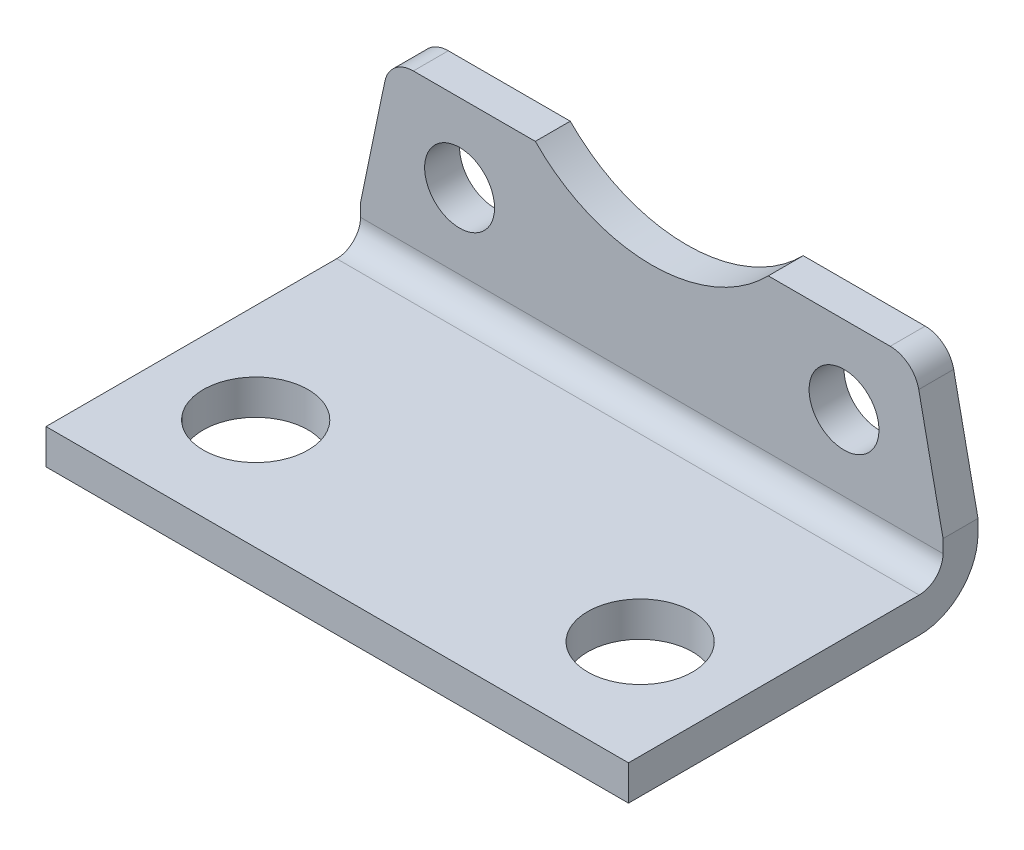
ISO-10303-21;
HEADER;
FILE_DESCRIPTION(('STEP AP214'),'2;1');
FILE_NAME('part.step','',(''),(''),'','','');
FILE_SCHEMA(('AUTOMOTIVE_DESIGN { 1 0 10303 214 1 1 1 1 }'));
ENDSEC;
DATA;
#1=APPLICATION_CONTEXT('core data for automotive mechanical design processes');
#2=APPLICATION_PROTOCOL_DEFINITION('international standard','automotive_design',2000,#1);
#3=PRODUCT_CONTEXT('',#1,'mechanical');
#4=PRODUCT('Part','Part','',(#3));
#5=PRODUCT_RELATED_PRODUCT_CATEGORY('part','',(#4));
#6=PRODUCT_DEFINITION_FORMATION('','',#4);
#7=PRODUCT_DEFINITION_CONTEXT('part definition',#1,'design');
#8=PRODUCT_DEFINITION('design','',#6,#7);
#9=PRODUCT_DEFINITION_SHAPE('','',#8);
#10=(LENGTH_UNIT() NAMED_UNIT(*) SI_UNIT(.MILLI.,.METRE.));
#11=(NAMED_UNIT(*) PLANE_ANGLE_UNIT() SI_UNIT($,.RADIAN.));
#12=(NAMED_UNIT(*) SI_UNIT($,.STERADIAN.) SOLID_ANGLE_UNIT());
#13=UNCERTAINTY_MEASURE_WITH_UNIT(LENGTH_MEASURE(1.E-05),#10,'distance_accuracy_value','');
#14=(GEOMETRIC_REPRESENTATION_CONTEXT(3) GLOBAL_UNCERTAINTY_ASSIGNED_CONTEXT((#13)) GLOBAL_UNIT_ASSIGNED_CONTEXT((#10,
#11,#12)) REPRESENTATION_CONTEXT('',''));
#15=CARTESIAN_POINT('',(0.,0.,0.));
#16=DIRECTION('',(0.,0.,1.));
#17=DIRECTION('',(1.,0.,0.));
#18=AXIS2_PLACEMENT_3D('',#15,#16,#17);
#19=CARTESIAN_POINT('',(-25.,5.05,49.5));
#20=DIRECTION('',(0.,0.,1.));
#21=DIRECTION('',(1.,0.,0.));
#22=AXIS2_PLACEMENT_3D('',#19,#20,#21);
#23=PLANE('',#22);
#24=DIRECTION('',(0.203466721205623,-0.979081862441458,0.));
#25=VECTOR('',#24,1.);
#26=CARTESIAN_POINT('',(22.5,18.2,49.5));
#27=LINE('',#26,#25);
#28=CARTESIAN_POINT('',(22.9138265164144,16.2086668030141,49.5));
#29=VERTEX_POINT('',#28);
#30=CARTESIAN_POINT('',(25.,6.17,49.5));
#31=VERTEX_POINT('',#30);
#32=EDGE_CURVE('E152',#29,#31,#27,.T.);
#33=ORIENTED_EDGE('',*,*,#32,.F.);
#34=CARTESIAN_POINT('',(20.4661218603107,15.7,49.5));
#35=DIRECTION('',(0.,0.,1.));
#36=DIRECTION('',(1.,0.,0.));
#37=AXIS2_PLACEMENT_3D('',#34,#35,#36);
#38=CIRCLE('',#37,2.5);
#39=CARTESIAN_POINT('',(20.4661218603107,18.2,49.5));
#40=VERTEX_POINT('',#39);
#41=EDGE_CURVE('E202',#29,#40,#38,.T.);
#42=ORIENTED_EDGE('',*,*,#41,.T.);
#43=DIRECTION('',(1.,0.,0.));
#44=VECTOR('',#43,1.);
#45=CARTESIAN_POINT('',(-25.,18.2,49.5));
#46=LINE('',#45,#44);
#47=CARTESIAN_POINT('',(9.99799979995999,18.2,49.5));
#48=VERTEX_POINT('',#47);
#49=EDGE_CURVE('E224',#48,#40,#46,.T.);
#50=ORIENTED_EDGE('',*,*,#49,.F.);
#51=CARTESIAN_POINT('',(0.,28.,49.5));
#52=DIRECTION('',(0.,0.,1.));
#53=DIRECTION('',(1.,0.,0.));
#54=AXIS2_PLACEMENT_3D('',#51,#52,#53);
#55=CIRCLE('',#54,14.);
#56=CARTESIAN_POINT('',(-9.99799979995999,18.2,49.5));
#57=VERTEX_POINT('',#56);
#58=EDGE_CURVE('E222',#57,#48,#55,.T.);
#59=ORIENTED_EDGE('',*,*,#58,.F.);
#60=CARTESIAN_POINT('',(-20.4661218603107,18.2,49.5));
#61=VERTEX_POINT('',#60);
#62=EDGE_CURVE('E213',#61,#57,#46,.T.);
#63=ORIENTED_EDGE('',*,*,#62,.F.);
#64=CARTESIAN_POINT('',(-20.4661218603107,15.7,49.5));
#65=DIRECTION('',(0.,0.,1.));
#66=DIRECTION('',(1.,0.,0.));
#67=AXIS2_PLACEMENT_3D('',#64,#65,#66);
#68=CIRCLE('',#67,2.5);
#69=CARTESIAN_POINT('',(-22.9138265164144,16.2086668030141,49.5));
#70=VERTEX_POINT('',#69);
#71=EDGE_CURVE('E200',#61,#70,#68,.T.);
#72=ORIENTED_EDGE('',*,*,#71,.T.);
#73=DIRECTION('',(0.203466721205623,0.979081862441458,0.));
#74=VECTOR('',#73,1.);
#75=CARTESIAN_POINT('',(-22.5,18.2,49.5));
#76=LINE('',#75,#74);
#77=CARTESIAN_POINT('',(-25.,6.17,49.5));
#78=VERTEX_POINT('',#77);
#79=EDGE_CURVE('E292',#78,#70,#76,.T.);
#80=ORIENTED_EDGE('',*,*,#79,.F.);
#81=DIRECTION('',(0.,-1.,0.));
#82=VECTOR('',#81,1.);
#83=CARTESIAN_POINT('',(-25.,5.05,49.5));
#84=LINE('',#83,#82);
#85=CARTESIAN_POINT('',(-25.,5.05,49.5));
#86=VERTEX_POINT('',#85);
#87=EDGE_CURVE('E265',#78,#86,#84,.T.);
#88=ORIENTED_EDGE('',*,*,#87,.T.);
#89=DIRECTION('',(1.,0.,0.));
#90=VECTOR('',#89,1.);
#91=CARTESIAN_POINT('',(-25.,5.05,49.5));
#92=LINE('',#91,#90);
#93=CARTESIAN_POINT('',(25.,5.05,49.5));
#94=VERTEX_POINT('',#93);
#95=EDGE_CURVE('E185',#86,#94,#92,.T.);
#96=ORIENTED_EDGE('',*,*,#95,.T.);
#97=DIRECTION('',(0.,-1.,0.));
#98=VECTOR('',#97,1.);
#99=CARTESIAN_POINT('',(25.,5.05,49.5));
#100=LINE('',#99,#98);
#101=EDGE_CURVE('E161',#31,#94,#100,.T.);
#102=ORIENTED_EDGE('',*,*,#101,.F.);
#103=EDGE_LOOP('',(#33,#42,#50,#59,#63,#72,#80,#88,#96,#102));
#104=FACE_BOUND('',#103,.T.);
#105=CARTESIAN_POINT('',(-16.5,11.5,49.5));
#106=DIRECTION('',(0.,0.,1.));
#107=DIRECTION('',(1.,0.,0.));
#108=AXIS2_PLACEMENT_3D('',#105,#106,#107);
#109=CIRCLE('',#108,3.);
#110=CARTESIAN_POINT('',(-13.5,11.5,49.5));
#111=VERTEX_POINT('',#110);
#112=EDGE_CURVE('E237',#111,#111,#109,.T.);
#113=ORIENTED_EDGE('',*,*,#112,.F.);
#114=EDGE_LOOP('',(#113));
#115=FACE_BOUND('',#114,.T.);
#116=CARTESIAN_POINT('',(16.5,11.5,49.5));
#117=DIRECTION('',(0.,0.,-1.));
#118=DIRECTION('',(-1.,0.,0.));
#119=AXIS2_PLACEMENT_3D('',#116,#117,#118);
#120=CIRCLE('',#119,3.);
#121=CARTESIAN_POINT('',(13.5,11.5,49.5));
#122=VERTEX_POINT('',#121);
#123=EDGE_CURVE('E232',#122,#122,#120,.T.);
#124=ORIENTED_EDGE('',*,*,#123,.T.);
#125=EDGE_LOOP('',(#124));
#126=FACE_BOUND('',#125,.T.);
#127=ADVANCED_FACE('F34',(#104,#115,#126),#23,.T.);
#128=CARTESIAN_POINT('',(-25.,5.05,46.5));
#129=DIRECTION('',(0.,0.,-1.));
#130=DIRECTION('',(0.,1.,0.));
#131=AXIS2_PLACEMENT_3D('',#128,#129,#130);
#132=PLANE('',#131);
#133=DIRECTION('',(1.,0.,0.));
#134=VECTOR('',#133,1.);
#135=CARTESIAN_POINT('',(-25.,18.2,46.5));
#136=LINE('',#135,#134);
#137=CARTESIAN_POINT('',(9.99799979995999,18.2,46.5));
#138=VERTEX_POINT('',#137);
#139=CARTESIAN_POINT('',(20.4661218603107,18.2,46.5));
#140=VERTEX_POINT('',#139);
#141=EDGE_CURVE('E223',#138,#140,#136,.T.);
#142=ORIENTED_EDGE('',*,*,#141,.T.);
#143=CARTESIAN_POINT('',(20.4661218603107,15.7,46.5));
#144=DIRECTION('',(0.,0.,-1.));
#145=DIRECTION('',(0.,1.,0.));
#146=AXIS2_PLACEMENT_3D('',#143,#144,#145);
#147=CIRCLE('',#146,2.5);
#148=CARTESIAN_POINT('',(22.9138265164144,16.2086668030141,46.5));
#149=VERTEX_POINT('',#148);
#150=EDGE_CURVE('E142',#140,#149,#147,.T.);
#151=ORIENTED_EDGE('',*,*,#150,.T.);
#152=DIRECTION('',(0.203466721205623,-0.979081862441458,0.));
#153=VECTOR('',#152,1.);
#154=CARTESIAN_POINT('',(22.5,18.2,46.5));
#155=LINE('',#154,#153);
#156=CARTESIAN_POINT('',(25.,6.17,46.5));
#157=VERTEX_POINT('',#156);
#158=EDGE_CURVE('E133',#149,#157,#155,.T.);
#159=ORIENTED_EDGE('',*,*,#158,.T.);
#160=DIRECTION('',(0.,1.,0.));
#161=VECTOR('',#160,1.);
#162=CARTESIAN_POINT('',(25.,5.05,46.5));
#163=LINE('',#162,#161);
#164=CARTESIAN_POINT('',(25.,5.05,46.5));
#165=VERTEX_POINT('',#164);
#166=EDGE_CURVE('E139',#165,#157,#163,.T.);
#167=ORIENTED_EDGE('',*,*,#166,.F.);
#168=DIRECTION('',(1.,0.,0.));
#169=VECTOR('',#168,1.);
#170=CARTESIAN_POINT('',(-25.,5.05,46.5));
#171=LINE('',#170,#169);
#172=CARTESIAN_POINT('',(-25.,5.05,46.5));
#173=VERTEX_POINT('',#172);
#174=EDGE_CURVE('E188',#173,#165,#171,.T.);
#175=ORIENTED_EDGE('',*,*,#174,.F.);
#176=DIRECTION('',(0.,1.,0.));
#177=VECTOR('',#176,1.);
#178=CARTESIAN_POINT('',(-25.,5.05,46.5));
#179=LINE('',#178,#177);
#180=CARTESIAN_POINT('',(-25.,6.17,46.5));
#181=VERTEX_POINT('',#180);
#182=EDGE_CURVE('E262',#173,#181,#179,.T.);
#183=ORIENTED_EDGE('',*,*,#182,.T.);
#184=DIRECTION('',(0.203466721205623,0.979081862441458,0.));
#185=VECTOR('',#184,1.);
#186=CARTESIAN_POINT('',(-22.5,18.2,46.5));
#187=LINE('',#186,#185);
#188=CARTESIAN_POINT('',(-22.9138265164144,16.2086668030141,46.5));
#189=VERTEX_POINT('',#188);
#190=EDGE_CURVE('E147',#181,#189,#187,.T.);
#191=ORIENTED_EDGE('',*,*,#190,.T.);
#192=CARTESIAN_POINT('',(-20.4661218603107,15.7,46.5));
#193=DIRECTION('',(0.,0.,-1.));
#194=DIRECTION('',(0.,1.,0.));
#195=AXIS2_PLACEMENT_3D('',#192,#193,#194);
#196=CIRCLE('',#195,2.5);
#197=CARTESIAN_POINT('',(-20.4661218603107,18.2,46.5));
#198=VERTEX_POINT('',#197);
#199=EDGE_CURVE('E49',#189,#198,#196,.T.);
#200=ORIENTED_EDGE('',*,*,#199,.T.);
#201=CARTESIAN_POINT('',(-9.99799979995999,18.2,46.5));
#202=VERTEX_POINT('',#201);
#203=EDGE_CURVE('E214',#198,#202,#136,.T.);
#204=ORIENTED_EDGE('',*,*,#203,.T.);
#205=CARTESIAN_POINT('',(0.,28.,46.5));
#206=DIRECTION('',(0.,0.,1.));
#207=DIRECTION('',(1.,0.,0.));
#208=AXIS2_PLACEMENT_3D('',#205,#206,#207);
#209=CIRCLE('',#208,14.);
#210=EDGE_CURVE('E229',#202,#138,#209,.T.);
#211=ORIENTED_EDGE('',*,*,#210,.T.);
#212=EDGE_LOOP('',(#142,#151,#159,#167,#175,#183,#191,#200,#204,#211));
#213=FACE_BOUND('',#212,.T.);
#214=CARTESIAN_POINT('',(-16.5,11.5,46.5));
#215=DIRECTION('',(0.,0.,1.));
#216=DIRECTION('',(1.,0.,0.));
#217=AXIS2_PLACEMENT_3D('',#214,#215,#216);
#218=CIRCLE('',#217,3.);
#219=CARTESIAN_POINT('',(-13.5,11.5,46.5));
#220=VERTEX_POINT('',#219);
#221=EDGE_CURVE('E240',#220,#220,#218,.T.);
#222=ORIENTED_EDGE('',*,*,#221,.T.);
#223=EDGE_LOOP('',(#222));
#224=FACE_BOUND('',#223,.T.);
#225=CARTESIAN_POINT('',(16.5,11.5,46.5));
#226=DIRECTION('',(0.,0.,-1.));
#227=DIRECTION('',(-1.,0.,0.));
#228=AXIS2_PLACEMENT_3D('',#225,#226,#227);
#229=CIRCLE('',#228,3.);
#230=CARTESIAN_POINT('',(13.5,11.5,46.5));
#231=VERTEX_POINT('',#230);
#232=EDGE_CURVE('E234',#231,#231,#229,.T.);
#233=ORIENTED_EDGE('',*,*,#232,.F.);
#234=EDGE_LOOP('',(#233));
#235=FACE_BOUND('',#234,.T.);
#236=ADVANCED_FACE('F136',(#213,#224,#235),#132,.T.);
#237=CARTESIAN_POINT('',(-25.,0.,76.5));
#238=DIRECTION('',(0.,-1.,0.));
#239=DIRECTION('',(0.,0.,-1.));
#240=AXIS2_PLACEMENT_3D('',#237,#238,#239);
#241=PLANE('',#240);
#242=DIRECTION('',(0.,0.,-1.));
#243=VECTOR('',#242,1.);
#244=CARTESIAN_POINT('',(25.,0.,76.5));
#245=LINE('',#244,#243);
#246=CARTESIAN_POINT('',(25.,0.,76.5));
#247=VERTEX_POINT('',#246);
#248=CARTESIAN_POINT('',(25.,0.,51.55));
#249=VERTEX_POINT('',#248);
#250=EDGE_CURVE('E165',#247,#249,#245,.T.);
#251=ORIENTED_EDGE('',*,*,#250,.F.);
#252=DIRECTION('',(1.,0.,0.));
#253=VECTOR('',#252,1.);
#254=CARTESIAN_POINT('',(-25.,0.,76.5));
#255=LINE('',#254,#253);
#256=CARTESIAN_POINT('',(-25.,0.,76.5));
#257=VERTEX_POINT('',#256);
#258=EDGE_CURVE('E178',#257,#247,#255,.T.);
#259=ORIENTED_EDGE('',*,*,#258,.F.);
#260=DIRECTION('',(0.,0.,-1.));
#261=VECTOR('',#260,1.);
#262=CARTESIAN_POINT('',(-25.,0.,76.5));
#263=LINE('',#262,#261);
#264=CARTESIAN_POINT('',(-25.,0.,51.55));
#265=VERTEX_POINT('',#264);
#266=EDGE_CURVE('E177',#257,#265,#263,.T.);
#267=ORIENTED_EDGE('',*,*,#266,.T.);
#268=DIRECTION('',(1.,0.,0.));
#269=VECTOR('',#268,1.);
#270=CARTESIAN_POINT('',(-25.,0.,51.55));
#271=LINE('',#270,#269);
#272=EDGE_CURVE('E190',#265,#249,#271,.T.);
#273=ORIENTED_EDGE('',*,*,#272,.T.);
#274=EDGE_LOOP('',(#251,#259,#267,#273));
#275=FACE_BOUND('',#274,.T.);
#276=CARTESIAN_POINT('',(-16.5,0.,67.));
#277=DIRECTION('',(0.,1.,0.));
#278=DIRECTION('',(0.,0.,1.));
#279=AXIS2_PLACEMENT_3D('',#276,#277,#278);
#280=CIRCLE('',#279,4.50000000000001);
#281=CARTESIAN_POINT('',(-16.5,0.,71.5));
#282=VERTEX_POINT('',#281);
#283=EDGE_CURVE('E252',#282,#282,#280,.T.);
#284=ORIENTED_EDGE('',*,*,#283,.T.);
#285=EDGE_LOOP('',(#284));
#286=FACE_BOUND('',#285,.T.);
#287=CARTESIAN_POINT('',(16.5,0.,67.));
#288=DIRECTION('',(0.,-1.,0.));
#289=DIRECTION('',(0.,0.,1.));
#290=AXIS2_PLACEMENT_3D('',#287,#288,#289);
#291=CIRCLE('',#290,4.50000000000001);
#292=CARTESIAN_POINT('',(16.5,0.,71.5));
#293=VERTEX_POINT('',#292);
#294=EDGE_CURVE('E246',#293,#293,#291,.T.);
#295=ORIENTED_EDGE('',*,*,#294,.F.);
#296=EDGE_LOOP('',(#295));
#297=FACE_BOUND('',#296,.T.);
#298=ADVANCED_FACE('F277',(#275,#286,#297),#241,.T.);
#299=CARTESIAN_POINT('',(-25.,3.,76.5));
#300=DIRECTION('',(0.,1.,0.));
#301=DIRECTION('',(0.,0.,1.));
#302=AXIS2_PLACEMENT_3D('',#299,#300,#301);
#303=PLANE('',#302);
#304=DIRECTION('',(0.,0.,1.));
#305=VECTOR('',#304,1.);
#306=CARTESIAN_POINT('',(25.,3.,76.5));
#307=LINE('',#306,#305);
#308=CARTESIAN_POINT('',(25.,3.,51.55));
#309=VERTEX_POINT('',#308);
#310=CARTESIAN_POINT('',(25.,3.,76.5));
#311=VERTEX_POINT('',#310);
#312=EDGE_CURVE('E171',#309,#311,#307,.T.);
#313=ORIENTED_EDGE('',*,*,#312,.F.);
#314=DIRECTION('',(1.,0.,0.));
#315=VECTOR('',#314,1.);
#316=CARTESIAN_POINT('',(-25.,3.,51.55));
#317=LINE('',#316,#315);
#318=CARTESIAN_POINT('',(-25.,3.,51.55));
#319=VERTEX_POINT('',#318);
#320=EDGE_CURVE('E183',#319,#309,#317,.T.);
#321=ORIENTED_EDGE('',*,*,#320,.F.);
#322=DIRECTION('',(0.,0.,1.));
#323=VECTOR('',#322,1.);
#324=CARTESIAN_POINT('',(-25.,3.,76.5));
#325=LINE('',#324,#323);
#326=CARTESIAN_POINT('',(-25.,3.,76.5));
#327=VERTEX_POINT('',#326);
#328=EDGE_CURVE('E270',#319,#327,#325,.T.);
#329=ORIENTED_EDGE('',*,*,#328,.T.);
#330=DIRECTION('',(1.,0.,0.));
#331=VECTOR('',#330,1.);
#332=CARTESIAN_POINT('',(-25.,3.,76.5));
#333=LINE('',#332,#331);
#334=EDGE_CURVE('E181',#327,#311,#333,.T.);
#335=ORIENTED_EDGE('',*,*,#334,.T.);
#336=EDGE_LOOP('',(#313,#321,#329,#335));
#337=FACE_BOUND('',#336,.T.);
#338=CARTESIAN_POINT('',(-16.5,3.,67.));
#339=DIRECTION('',(0.,1.,0.));
#340=DIRECTION('',(0.,0.,1.));
#341=AXIS2_PLACEMENT_3D('',#338,#339,#340);
#342=CIRCLE('',#341,4.50000000000001);
#343=CARTESIAN_POINT('',(-16.5,3.,71.5));
#344=VERTEX_POINT('',#343);
#345=EDGE_CURVE('E249',#344,#344,#342,.T.);
#346=ORIENTED_EDGE('',*,*,#345,.F.);
#347=EDGE_LOOP('',(#346));
#348=FACE_BOUND('',#347,.T.);
#349=CARTESIAN_POINT('',(16.5,3.,67.));
#350=DIRECTION('',(0.,-1.,0.));
#351=DIRECTION('',(0.,0.,1.));
#352=AXIS2_PLACEMENT_3D('',#349,#350,#351);
#353=CIRCLE('',#352,4.50000000000001);
#354=CARTESIAN_POINT('',(16.5,3.,71.5));
#355=VERTEX_POINT('',#354);
#356=EDGE_CURVE('E243',#355,#355,#353,.T.);
#357=ORIENTED_EDGE('',*,*,#356,.T.);
#358=EDGE_LOOP('',(#357));
#359=FACE_BOUND('',#358,.T.);
#360=ADVANCED_FACE('F314',(#337,#348,#359),#303,.T.);
#361=CARTESIAN_POINT('',(-25.,0.,76.5));
#362=DIRECTION('',(0.,0.,1.));
#363=DIRECTION('',(1.,0.,0.));
#364=AXIS2_PLACEMENT_3D('',#361,#362,#363);
#365=PLANE('',#364);
#366=DIRECTION('',(0.,-1.,0.));
#367=VECTOR('',#366,1.);
#368=CARTESIAN_POINT('',(25.,0.,76.5));
#369=LINE('',#368,#367);
#370=EDGE_CURVE('E174',#311,#247,#369,.T.);
#371=ORIENTED_EDGE('',*,*,#370,.F.);
#372=ORIENTED_EDGE('',*,*,#334,.F.);
#373=DIRECTION('',(0.,-1.,0.));
#374=VECTOR('',#373,1.);
#375=CARTESIAN_POINT('',(-25.,0.,76.5));
#376=LINE('',#375,#374);
#377=EDGE_CURVE('E192',#327,#257,#376,.T.);
#378=ORIENTED_EDGE('',*,*,#377,.T.);
#379=ORIENTED_EDGE('',*,*,#258,.T.);
#380=EDGE_LOOP('',(#371,#372,#378,#379));
#381=FACE_BOUND('',#380,.T.);
#382=ADVANCED_FACE('F318',(#381),#365,.T.);
#383=CARTESIAN_POINT('',(-25.,5.05,51.55));
#384=DIRECTION('',(1.,0.,0.));
#385=DIRECTION('',(0.,0.,-1.));
#386=AXIS2_PLACEMENT_3D('',#383,#384,#385);
#387=CYLINDRICAL_SURFACE('',#386,2.05);
#388=CARTESIAN_POINT('',(25.,5.05,51.55));
#389=DIRECTION('',(-1.,0.,0.));
#390=DIRECTION('',(0.,0.,-1.));
#391=AXIS2_PLACEMENT_3D('',#388,#389,#390);
#392=CIRCLE('',#391,2.05);
#393=EDGE_CURVE('E163',#94,#309,#392,.T.);
#394=ORIENTED_EDGE('',*,*,#393,.F.);
#395=ORIENTED_EDGE('',*,*,#95,.F.);
#396=CARTESIAN_POINT('',(-25.,5.05,51.55));
#397=DIRECTION('',(-1.,0.,0.));
#398=DIRECTION('',(0.,0.,-1.));
#399=AXIS2_PLACEMENT_3D('',#396,#397,#398);
#400=CIRCLE('',#399,2.05);
#401=EDGE_CURVE('E267',#86,#319,#400,.T.);
#402=ORIENTED_EDGE('',*,*,#401,.T.);
#403=ORIENTED_EDGE('',*,*,#320,.T.);
#404=EDGE_LOOP('',(#394,#395,#402,#403));
#405=FACE_BOUND('',#404,.T.);
#406=ADVANCED_FACE('F308',(#405),#387,.F.);
#407=CARTESIAN_POINT('',(-25.,5.05,51.55));
#408=DIRECTION('',(1.,0.,0.));
#409=DIRECTION('',(0.,0.,-1.));
#410=AXIS2_PLACEMENT_3D('',#407,#408,#409);
#411=CYLINDRICAL_SURFACE('',#410,5.05000000000001);
#412=CARTESIAN_POINT('',(25.,5.05,51.55));
#413=DIRECTION('',(1.,0.,0.));
#414=DIRECTION('',(0.,0.,-1.));
#415=AXIS2_PLACEMENT_3D('',#412,#413,#414);
#416=CIRCLE('',#415,5.05000000000001);
#417=EDGE_CURVE('E160',#249,#165,#416,.T.);
#418=ORIENTED_EDGE('',*,*,#417,.F.);
#419=ORIENTED_EDGE('',*,*,#272,.F.);
#420=CARTESIAN_POINT('',(-25.,5.05,51.55));
#421=DIRECTION('',(1.,0.,0.));
#422=DIRECTION('',(0.,0.,-1.));
#423=AXIS2_PLACEMENT_3D('',#420,#421,#422);
#424=CIRCLE('',#423,5.05000000000001);
#425=EDGE_CURVE('E259',#265,#173,#424,.T.);
#426=ORIENTED_EDGE('',*,*,#425,.T.);
#427=ORIENTED_EDGE('',*,*,#174,.T.);
#428=EDGE_LOOP('',(#418,#419,#426,#427));
#429=FACE_BOUND('',#428,.T.);
#430=ADVANCED_FACE('F282',(#429),#411,.T.);
#431=CARTESIAN_POINT('',(-25.,5.05,51.55));
#432=DIRECTION('',(1.,0.,0.));
#433=DIRECTION('',(0.,0.,-1.));
#434=AXIS2_PLACEMENT_3D('',#431,#432,#433);
#435=PLANE('',#434);
#436=ORIENTED_EDGE('',*,*,#87,.F.);
#437=DIRECTION('',(0.,0.,1.));
#438=VECTOR('',#437,1.);
#439=CARTESIAN_POINT('',(-25.,6.17,46.5));
#440=LINE('',#439,#438);
#441=EDGE_CURVE('E155',#181,#78,#440,.T.);
#442=ORIENTED_EDGE('',*,*,#441,.F.);
#443=ORIENTED_EDGE('',*,*,#182,.F.);
#444=ORIENTED_EDGE('',*,*,#425,.F.);
#445=ORIENTED_EDGE('',*,*,#266,.F.);
#446=ORIENTED_EDGE('',*,*,#377,.F.);
#447=ORIENTED_EDGE('',*,*,#328,.F.);
#448=ORIENTED_EDGE('',*,*,#401,.F.);
#449=EDGE_LOOP('',(#436,#442,#443,#444,#445,#446,#447,#448));
#450=FACE_BOUND('',#449,.T.);
#451=ADVANCED_FACE('F287',(#450),#435,.F.);
#452=CARTESIAN_POINT('',(25.,5.05,51.55));
#453=DIRECTION('',(1.,0.,0.));
#454=DIRECTION('',(0.,0.,-1.));
#455=AXIS2_PLACEMENT_3D('',#452,#453,#454);
#456=PLANE('',#455);
#457=DIRECTION('',(0.,0.,1.));
#458=VECTOR('',#457,1.);
#459=CARTESIAN_POINT('',(25.,6.17,46.5));
#460=LINE('',#459,#458);
#461=EDGE_CURVE('E146',#157,#31,#460,.T.);
#462=ORIENTED_EDGE('',*,*,#461,.T.);
#463=ORIENTED_EDGE('',*,*,#101,.T.);
#464=ORIENTED_EDGE('',*,*,#393,.T.);
#465=ORIENTED_EDGE('',*,*,#312,.T.);
#466=ORIENTED_EDGE('',*,*,#370,.T.);
#467=ORIENTED_EDGE('',*,*,#250,.T.);
#468=ORIENTED_EDGE('',*,*,#417,.T.);
#469=ORIENTED_EDGE('',*,*,#166,.T.);
#470=EDGE_LOOP('',(#462,#463,#464,#465,#466,#467,#468,#469));
#471=FACE_BOUND('',#470,.T.);
#472=ADVANCED_FACE('F157',(#471),#456,.T.);
#473=CARTESIAN_POINT('',(-16.5,0.,67.));
#474=DIRECTION('',(0.,1.,0.));
#475=DIRECTION('',(0.,0.,1.));
#476=AXIS2_PLACEMENT_3D('',#473,#474,#475);
#477=CYLINDRICAL_SURFACE('',#476,4.50000000000001);
#478=ORIENTED_EDGE('',*,*,#283,.F.);
#479=EDGE_LOOP('',(#478));
#480=FACE_BOUND('',#479,.T.);
#481=ORIENTED_EDGE('',*,*,#345,.T.);
#482=EDGE_LOOP('',(#481));
#483=FACE_BOUND('',#482,.T.);
#484=ADVANCED_FACE('F330',(#480,#483),#477,.F.);
#485=CARTESIAN_POINT('',(16.5,0.,67.));
#486=DIRECTION('',(0.,1.,0.));
#487=DIRECTION('',(0.,0.,1.));
#488=AXIS2_PLACEMENT_3D('',#485,#486,#487);
#489=CYLINDRICAL_SURFACE('',#488,4.50000000000001);
#490=ORIENTED_EDGE('',*,*,#294,.T.);
#491=EDGE_LOOP('',(#490));
#492=FACE_BOUND('',#491,.T.);
#493=ORIENTED_EDGE('',*,*,#356,.F.);
#494=EDGE_LOOP('',(#493));
#495=FACE_BOUND('',#494,.T.);
#496=ADVANCED_FACE('F335',(#492,#495),#489,.F.);
#497=CARTESIAN_POINT('',(-16.5,11.5,46.5));
#498=DIRECTION('',(0.,0.,1.));
#499=DIRECTION('',(1.,0.,0.));
#500=AXIS2_PLACEMENT_3D('',#497,#498,#499);
#501=CYLINDRICAL_SURFACE('',#500,3.);
#502=ORIENTED_EDGE('',*,*,#221,.F.);
#503=EDGE_LOOP('',(#502));
#504=FACE_BOUND('',#503,.T.);
#505=ORIENTED_EDGE('',*,*,#112,.T.);
#506=EDGE_LOOP('',(#505));
#507=FACE_BOUND('',#506,.T.);
#508=ADVANCED_FACE('F339',(#504,#507),#501,.F.);
#509=CARTESIAN_POINT('',(16.5,11.5,46.5));
#510=DIRECTION('',(0.,0.,1.));
#511=DIRECTION('',(1.,0.,0.));
#512=AXIS2_PLACEMENT_3D('',#509,#510,#511);
#513=CYLINDRICAL_SURFACE('',#512,3.);
#514=ORIENTED_EDGE('',*,*,#232,.T.);
#515=EDGE_LOOP('',(#514));
#516=FACE_BOUND('',#515,.T.);
#517=ORIENTED_EDGE('',*,*,#123,.F.);
#518=EDGE_LOOP('',(#517));
#519=FACE_BOUND('',#518,.T.);
#520=ADVANCED_FACE('F343',(#516,#519),#513,.F.);
#521=CARTESIAN_POINT('',(0.,28.,46.5));
#522=DIRECTION('',(0.,0.,1.));
#523=DIRECTION('',(1.,0.,0.));
#524=AXIS2_PLACEMENT_3D('',#521,#522,#523);
#525=CYLINDRICAL_SURFACE('',#524,14.);
#526=ORIENTED_EDGE('',*,*,#58,.T.);
#527=DIRECTION('',(0.,0.,1.));
#528=VECTOR('',#527,1.);
#529=CARTESIAN_POINT('',(9.99799979995999,18.2,46.5));
#530=LINE('',#529,#528);
#531=EDGE_CURVE('E195',#48,#138,#530,.F.);
#532=ORIENTED_EDGE('',*,*,#531,.T.);
#533=ORIENTED_EDGE('',*,*,#210,.F.);
#534=DIRECTION('',(0.,0.,1.));
#535=VECTOR('',#534,1.);
#536=CARTESIAN_POINT('',(-9.99799979995999,18.2,46.5));
#537=LINE('',#536,#535);
#538=EDGE_CURVE('E180',#202,#57,#537,.T.);
#539=ORIENTED_EDGE('',*,*,#538,.T.);
#540=EDGE_LOOP('',(#526,#532,#533,#539));
#541=FACE_BOUND('',#540,.T.);
#542=ADVANCED_FACE('F347',(#541),#525,.F.);
#543=CARTESIAN_POINT('',(-25.,18.2,46.5));
#544=DIRECTION('',(0.,-1.,0.));
#545=DIRECTION('',(0.,0.,-1.));
#546=AXIS2_PLACEMENT_3D('',#543,#544,#545);
#547=PLANE('',#546);
#548=ORIENTED_EDGE('',*,*,#203,.F.);
#549=DIRECTION('',(0.,0.,1.));
#550=VECTOR('',#549,1.);
#551=CARTESIAN_POINT('',(-20.4661218603107,18.2,46.5));
#552=LINE('',#551,#550);
#553=EDGE_CURVE('E42',#198,#61,#552,.T.);
#554=ORIENTED_EDGE('',*,*,#553,.T.);
#555=ORIENTED_EDGE('',*,*,#62,.T.);
#556=ORIENTED_EDGE('',*,*,#538,.F.);
#557=EDGE_LOOP('',(#548,#554,#555,#556));
#558=FACE_BOUND('',#557,.T.);
#559=ADVANCED_FACE('F211',(#558),#547,.F.);
#560=ORIENTED_EDGE('',*,*,#49,.T.);
#561=DIRECTION('',(0.,0.,1.));
#562=VECTOR('',#561,1.);
#563=CARTESIAN_POINT('',(20.4661218603107,18.2,46.5));
#564=LINE('',#563,#562);
#565=EDGE_CURVE('E204',#40,#140,#564,.F.);
#566=ORIENTED_EDGE('',*,*,#565,.T.);
#567=ORIENTED_EDGE('',*,*,#141,.F.);
#568=ORIENTED_EDGE('',*,*,#531,.F.);
#569=EDGE_LOOP('',(#560,#566,#567,#568));
#570=FACE_BOUND('',#569,.T.);
#571=ADVANCED_FACE('F352',(#570),#547,.F.);
#572=CARTESIAN_POINT('',(22.5,18.2,46.5));
#573=DIRECTION('',(-0.979081862441458,-0.203466721205623,0.));
#574=DIRECTION('',(0.203466721205623,-0.979081862441458,0.));
#575=AXIS2_PLACEMENT_3D('',#572,#573,#574);
#576=PLANE('',#575);
#577=ORIENTED_EDGE('',*,*,#158,.F.);
#578=DIRECTION('',(0.,0.,1.));
#579=VECTOR('',#578,1.);
#580=CARTESIAN_POINT('',(22.9138265164144,16.2086668030141,46.5));
#581=LINE('',#580,#579);
#582=EDGE_CURVE('E198',#149,#29,#581,.T.);
#583=ORIENTED_EDGE('',*,*,#582,.T.);
#584=ORIENTED_EDGE('',*,*,#32,.T.);
#585=ORIENTED_EDGE('',*,*,#461,.F.);
#586=EDGE_LOOP('',(#577,#583,#584,#585));
#587=FACE_BOUND('',#586,.T.);
#588=ADVANCED_FACE('F150',(#587),#576,.F.);
#589=CARTESIAN_POINT('',(-22.5,18.2,46.5));
#590=DIRECTION('',(0.979081862441458,-0.203466721205623,0.));
#591=DIRECTION('',(0.203466721205623,0.979081862441458,0.));
#592=AXIS2_PLACEMENT_3D('',#589,#590,#591);
#593=PLANE('',#592);
#594=ORIENTED_EDGE('',*,*,#79,.T.);
#595=DIRECTION('',(0.,0.,1.));
#596=VECTOR('',#595,1.);
#597=CARTESIAN_POINT('',(-22.9138265164144,16.2086668030141,46.5));
#598=LINE('',#597,#596);
#599=EDGE_CURVE('E11',#70,#189,#598,.F.);
#600=ORIENTED_EDGE('',*,*,#599,.T.);
#601=ORIENTED_EDGE('',*,*,#190,.F.);
#602=ORIENTED_EDGE('',*,*,#441,.T.);
#603=EDGE_LOOP('',(#594,#600,#601,#602));
#604=FACE_BOUND('',#603,.T.);
#605=ADVANCED_FACE('F299',(#604),#593,.F.);
#606=CARTESIAN_POINT('',(20.4661218603107,15.7,46.5));
#607=DIRECTION('',(0.,0.,1.));
#608=DIRECTION('',(1.,0.,0.));
#609=AXIS2_PLACEMENT_3D('',#606,#607,#608);
#610=CYLINDRICAL_SURFACE('',#609,2.5);
#611=ORIENTED_EDGE('',*,*,#150,.F.);
#612=ORIENTED_EDGE('',*,*,#565,.F.);
#613=ORIENTED_EDGE('',*,*,#41,.F.);
#614=ORIENTED_EDGE('',*,*,#582,.F.);
#615=EDGE_LOOP('',(#611,#612,#613,#614));
#616=FACE_BOUND('',#615,.T.);
#617=ADVANCED_FACE('F295',(#616),#610,.T.);
#618=CARTESIAN_POINT('',(-20.4661218603107,15.7,46.5));
#619=DIRECTION('',(0.,0.,1.));
#620=DIRECTION('',(1.,0.,0.));
#621=AXIS2_PLACEMENT_3D('',#618,#619,#620);
#622=CYLINDRICAL_SURFACE('',#621,2.5);
#623=ORIENTED_EDGE('',*,*,#199,.F.);
#624=ORIENTED_EDGE('',*,*,#599,.F.);
#625=ORIENTED_EDGE('',*,*,#71,.F.);
#626=ORIENTED_EDGE('',*,*,#553,.F.);
#627=EDGE_LOOP('',(#623,#624,#625,#626));
#628=FACE_BOUND('',#627,.T.);
#629=ADVANCED_FACE('F36',(#628),#622,.T.);
#630=CLOSED_SHELL('',(#127,#236,#298,#360,#382,#406,#430,#451,#472,#484,#496,#508,#520,#542,
#559,#571,#588,#605,#617,#629));
#631=MANIFOLD_SOLID_BREP('B2',#630);
#632=ADVANCED_BREP_SHAPE_REPRESENTATION('',(#18,#631),#14);
#633=SHAPE_DEFINITION_REPRESENTATION(#9,#632);
ENDSEC;
END-ISO-10303-21;
